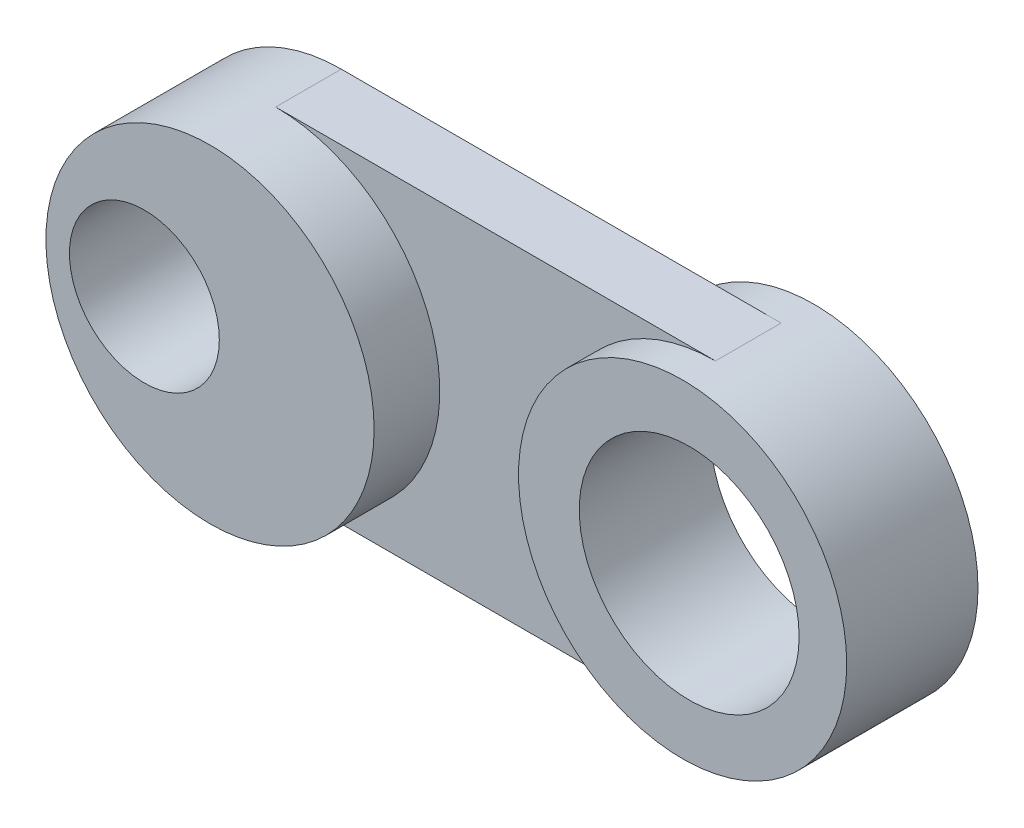
ISO-10303-21;
HEADER;
FILE_DESCRIPTION(('STEP AP214'),'2;1');
FILE_NAME('part.step','',(''),(''),'','','');
FILE_SCHEMA(('AUTOMOTIVE_DESIGN { 1 0 10303 214 1 1 1 1 }'));
ENDSEC;
DATA;
#1=APPLICATION_CONTEXT('core data for automotive mechanical design processes');
#2=APPLICATION_PROTOCOL_DEFINITION('international standard','automotive_design',2000,#1);
#3=PRODUCT_CONTEXT('',#1,'mechanical');
#4=PRODUCT('Part','Part','',(#3));
#5=PRODUCT_RELATED_PRODUCT_CATEGORY('part','',(#4));
#6=PRODUCT_DEFINITION_FORMATION('','',#4);
#7=PRODUCT_DEFINITION_CONTEXT('part definition',#1,'design');
#8=PRODUCT_DEFINITION('design','',#6,#7);
#9=PRODUCT_DEFINITION_SHAPE('','',#8);
#10=(LENGTH_UNIT() NAMED_UNIT(*) SI_UNIT(.MILLI.,.METRE.));
#11=(NAMED_UNIT(*) PLANE_ANGLE_UNIT() SI_UNIT($,.RADIAN.));
#12=(NAMED_UNIT(*) SI_UNIT($,.STERADIAN.) SOLID_ANGLE_UNIT());
#13=UNCERTAINTY_MEASURE_WITH_UNIT(LENGTH_MEASURE(1.E-05),#10,'distance_accuracy_value','');
#14=(GEOMETRIC_REPRESENTATION_CONTEXT(3) GLOBAL_UNCERTAINTY_ASSIGNED_CONTEXT((#13)) GLOBAL_UNIT_ASSIGNED_CONTEXT((#10,
#11,#12)) REPRESENTATION_CONTEXT('',''));
#15=CARTESIAN_POINT('',(0.,0.,0.));
#16=DIRECTION('',(0.,0.,1.));
#17=DIRECTION('',(1.,0.,0.));
#18=AXIS2_PLACEMENT_3D('',#15,#16,#17);
#19=CARTESIAN_POINT('',(0.,6.35,1.27));
#20=DIRECTION('',(0.,0.,-1.));
#21=DIRECTION('',(-1.,0.,0.));
#22=AXIS2_PLACEMENT_3D('',#19,#20,#21);
#23=PLANE('',#22);
#24=CARTESIAN_POINT('',(17.018,6.35,1.27));
#25=DIRECTION('',(0.,0.,-1.));
#26=DIRECTION('',(-1.,0.,0.));
#27=AXIS2_PLACEMENT_3D('',#24,#25,#26);
#28=CIRCLE('',#27,6.35);
#29=CARTESIAN_POINT('',(17.018,12.7,1.27));
#30=VERTEX_POINT('',#29);
#31=CARTESIAN_POINT('',(17.018,0.,1.27));
#32=VERTEX_POINT('',#31);
#33=EDGE_CURVE('E64',#30,#32,#28,.F.);
#34=ORIENTED_EDGE('',*,*,#33,.F.);
#35=DIRECTION('',(-1.,0.,0.));
#36=VECTOR('',#35,1.);
#37=CARTESIAN_POINT('',(0.,12.7,1.27));
#38=LINE('',#37,#36);
#39=CARTESIAN_POINT('',(0.,12.7,1.27));
#40=VERTEX_POINT('',#39);
#41=EDGE_CURVE('E102',#30,#40,#38,.T.);
#42=ORIENTED_EDGE('',*,*,#41,.T.);
#43=CARTESIAN_POINT('',(0.,6.35,1.27));
#44=DIRECTION('',(0.,0.,1.));
#45=DIRECTION('',(1.,0.,0.));
#46=AXIS2_PLACEMENT_3D('',#43,#44,#45);
#47=CIRCLE('',#46,6.35);
#48=CARTESIAN_POINT('',(0.,0.,1.27));
#49=VERTEX_POINT('',#48);
#50=EDGE_CURVE('E11',#49,#40,#47,.T.);
#51=ORIENTED_EDGE('',*,*,#50,.F.);
#52=DIRECTION('',(1.,0.,0.));
#53=VECTOR('',#52,1.);
#54=CARTESIAN_POINT('',(0.,0.,1.27));
#55=LINE('',#54,#53);
#56=EDGE_CURVE('E93',#49,#32,#55,.T.);
#57=ORIENTED_EDGE('',*,*,#56,.T.);
#58=EDGE_LOOP('',(#34,#42,#51,#57));
#59=FACE_BOUND('',#58,.T.);
#60=ADVANCED_FACE('F45',(#59),#23,.F.);
#61=CARTESIAN_POINT('',(0.,6.35,-1.27));
#62=DIRECTION('',(0.,0.,-1.));
#63=DIRECTION('',(-1.,0.,0.));
#64=AXIS2_PLACEMENT_3D('',#61,#62,#63);
#65=PLANE('',#64);
#66=CARTESIAN_POINT('',(-2.54,6.35,-1.27));
#67=DIRECTION('',(0.,0.,1.));
#68=DIRECTION('',(1.,0.,0.));
#69=AXIS2_PLACEMENT_3D('',#66,#67,#68);
#70=CIRCLE('',#69,2.9);
#71=CARTESIAN_POINT('',(0.36,6.35,-1.27));
#72=VERTEX_POINT('',#71);
#73=EDGE_CURVE('E107',#72,#72,#70,.T.);
#74=ORIENTED_EDGE('',*,*,#73,.T.);
#75=EDGE_LOOP('',(#74));
#76=FACE_BOUND('',#75,.T.);
#77=DIRECTION('',(-1.,0.,0.));
#78=VECTOR('',#77,1.);
#79=CARTESIAN_POINT('',(0.,12.7,-1.27));
#80=LINE('',#79,#78);
#81=CARTESIAN_POINT('',(17.018,12.7,-1.27));
#82=VERTEX_POINT('',#81);
#83=CARTESIAN_POINT('',(0.,12.7,-1.27));
#84=VERTEX_POINT('',#83);
#85=EDGE_CURVE('E84',#82,#84,#80,.T.);
#86=ORIENTED_EDGE('',*,*,#85,.F.);
#87=CARTESIAN_POINT('',(17.018,6.35,-1.27));
#88=DIRECTION('',(0.,0.,-1.));
#89=DIRECTION('',(-1.,0.,0.));
#90=AXIS2_PLACEMENT_3D('',#87,#88,#89);
#91=CIRCLE('',#90,6.35);
#92=CARTESIAN_POINT('',(17.018,0.,-1.27));
#93=VERTEX_POINT('',#92);
#94=EDGE_CURVE('E78',#82,#93,#91,.F.);
#95=ORIENTED_EDGE('',*,*,#94,.T.);
#96=DIRECTION('',(1.,0.,0.));
#97=VECTOR('',#96,1.);
#98=CARTESIAN_POINT('',(0.,0.,-1.27));
#99=LINE('',#98,#97);
#100=CARTESIAN_POINT('',(0.,0.,-1.27));
#101=VERTEX_POINT('',#100);
#102=EDGE_CURVE('E94',#101,#93,#99,.T.);
#103=ORIENTED_EDGE('',*,*,#102,.F.);
#104=CARTESIAN_POINT('',(0.,6.35,-1.27));
#105=DIRECTION('',(0.,0.,1.));
#106=DIRECTION('',(-1.,0.,0.));
#107=AXIS2_PLACEMENT_3D('',#104,#105,#106);
#108=CIRCLE('',#107,6.35);
#109=EDGE_CURVE('E100',#84,#101,#108,.T.);
#110=ORIENTED_EDGE('',*,*,#109,.F.);
#111=EDGE_LOOP('',(#86,#95,#103,#110));
#112=FACE_BOUND('',#111,.T.);
#113=ADVANCED_FACE('F104',(#76,#112),#65,.T.);
#114=CARTESIAN_POINT('',(0.,6.35,1.27));
#115=DIRECTION('',(0.,0.,-1.));
#116=DIRECTION('',(-1.,0.,0.));
#117=AXIS2_PLACEMENT_3D('',#114,#115,#116);
#118=CYLINDRICAL_SURFACE('',#117,6.35);
#119=ORIENTED_EDGE('',*,*,#109,.T.);
#120=DIRECTION('',(0.,0.,-1.));
#121=VECTOR('',#120,1.);
#122=CARTESIAN_POINT('',(0.,0.,1.27));
#123=LINE('',#122,#121);
#124=EDGE_CURVE('E49',#49,#101,#123,.T.);
#125=ORIENTED_EDGE('',*,*,#124,.F.);
#126=ORIENTED_EDGE('',*,*,#50,.T.);
#127=DIRECTION('',(0.,0.,-1.));
#128=VECTOR('',#127,1.);
#129=CARTESIAN_POINT('',(0.,12.7,1.27));
#130=LINE('',#129,#128);
#131=EDGE_CURVE('E88',#40,#84,#130,.T.);
#132=ORIENTED_EDGE('',*,*,#131,.T.);
#133=EDGE_LOOP('',(#119,#125,#126,#132));
#134=FACE_BOUND('',#133,.T.);
#135=CARTESIAN_POINT('',(0.,6.35,3.81));
#136=DIRECTION('',(0.,0.,1.));
#137=DIRECTION('',(1.,0.,0.));
#138=AXIS2_PLACEMENT_3D('',#135,#136,#137);
#139=CIRCLE('',#138,6.35);
#140=CARTESIAN_POINT('',(6.35,6.35,3.81));
#141=VERTEX_POINT('',#140);
#142=EDGE_CURVE('E113',#141,#141,#139,.T.);
#143=ORIENTED_EDGE('',*,*,#142,.F.);
#144=EDGE_LOOP('',(#143));
#145=FACE_BOUND('',#144,.T.);
#146=ADVANCED_FACE('F47',(#134,#145),#118,.T.);
#147=CARTESIAN_POINT('',(0.,0.,1.27));
#148=DIRECTION('',(0.,1.,0.));
#149=DIRECTION('',(-1.,0.,0.));
#150=AXIS2_PLACEMENT_3D('',#147,#148,#149);
#151=PLANE('',#150);
#152=ORIENTED_EDGE('',*,*,#102,.T.);
#153=DIRECTION('',(0.,0.,-1.));
#154=VECTOR('',#153,1.);
#155=CARTESIAN_POINT('',(17.018,0.,1.27));
#156=LINE('',#155,#154);
#157=EDGE_CURVE('E119',#32,#93,#156,.T.);
#158=ORIENTED_EDGE('',*,*,#157,.F.);
#159=ORIENTED_EDGE('',*,*,#56,.F.);
#160=ORIENTED_EDGE('',*,*,#124,.T.);
#161=EDGE_LOOP('',(#152,#158,#159,#160));
#162=FACE_BOUND('',#161,.T.);
#163=ADVANCED_FACE('F127',(#162),#151,.F.);
#164=CARTESIAN_POINT('',(17.018,6.35,1.27));
#165=DIRECTION('',(0.,0.,-1.));
#166=DIRECTION('',(-1.,0.,0.));
#167=AXIS2_PLACEMENT_3D('',#164,#165,#166);
#168=CYLINDRICAL_SURFACE('',#167,6.35);
#169=ORIENTED_EDGE('',*,*,#157,.T.);
#170=ORIENTED_EDGE('',*,*,#94,.F.);
#171=DIRECTION('',(0.,0.,-1.));
#172=VECTOR('',#171,1.);
#173=CARTESIAN_POINT('',(17.018,12.7,1.27));
#174=LINE('',#173,#172);
#175=EDGE_CURVE('E90',#30,#82,#174,.T.);
#176=ORIENTED_EDGE('',*,*,#175,.F.);
#177=ORIENTED_EDGE('',*,*,#33,.T.);
#178=EDGE_LOOP('',(#169,#170,#176,#177));
#179=FACE_BOUND('',#178,.T.);
#180=CARTESIAN_POINT('',(17.018,6.35,-2.54));
#181=DIRECTION('',(0.,0.,1.));
#182=DIRECTION('',(1.,0.,0.));
#183=AXIS2_PLACEMENT_3D('',#180,#181,#182);
#184=CIRCLE('',#183,6.35);
#185=CARTESIAN_POINT('',(23.368,6.35,-2.54));
#186=VERTEX_POINT('',#185);
#187=EDGE_CURVE('E144',#186,#186,#184,.T.);
#188=ORIENTED_EDGE('',*,*,#187,.T.);
#189=EDGE_LOOP('',(#188));
#190=FACE_BOUND('',#189,.T.);
#191=CARTESIAN_POINT('',(17.018,6.35,2.54));
#192=DIRECTION('',(0.,0.,1.));
#193=DIRECTION('',(1.,0.,0.));
#194=AXIS2_PLACEMENT_3D('',#191,#192,#193);
#195=CIRCLE('',#194,6.35);
#196=CARTESIAN_POINT('',(23.368,6.35,2.54));
#197=VERTEX_POINT('',#196);
#198=EDGE_CURVE('E143',#197,#197,#195,.T.);
#199=ORIENTED_EDGE('',*,*,#198,.F.);
#200=EDGE_LOOP('',(#199));
#201=FACE_BOUND('',#200,.T.);
#202=ADVANCED_FACE('F185',(#179,#190,#201),#168,.T.);
#203=CARTESIAN_POINT('',(0.,12.7,1.27));
#204=DIRECTION('',(0.,-1.,0.));
#205=DIRECTION('',(1.,0.,0.));
#206=AXIS2_PLACEMENT_3D('',#203,#204,#205);
#207=PLANE('',#206);
#208=ORIENTED_EDGE('',*,*,#85,.T.);
#209=ORIENTED_EDGE('',*,*,#131,.F.);
#210=ORIENTED_EDGE('',*,*,#41,.F.);
#211=ORIENTED_EDGE('',*,*,#175,.T.);
#212=EDGE_LOOP('',(#208,#209,#210,#211));
#213=FACE_BOUND('',#212,.T.);
#214=ADVANCED_FACE('F86',(#213),#207,.F.);
#215=CARTESIAN_POINT('',(-2.54,6.35,1.27));
#216=DIRECTION('',(0.,0.,-1.));
#217=DIRECTION('',(-1.,0.,0.));
#218=AXIS2_PLACEMENT_3D('',#215,#216,#217);
#219=CYLINDRICAL_SURFACE('',#218,2.9);
#220=ORIENTED_EDGE('',*,*,#73,.F.);
#221=EDGE_LOOP('',(#220));
#222=FACE_BOUND('',#221,.T.);
#223=CARTESIAN_POINT('',(-2.54,6.35,3.81));
#224=DIRECTION('',(0.,0.,1.));
#225=DIRECTION('',(1.,0.,0.));
#226=AXIS2_PLACEMENT_3D('',#223,#224,#225);
#227=CIRCLE('',#226,2.9);
#228=CARTESIAN_POINT('',(0.36,6.35,3.81));
#229=VERTEX_POINT('',#228);
#230=EDGE_CURVE('E135',#229,#229,#227,.F.);
#231=ORIENTED_EDGE('',*,*,#230,.F.);
#232=EDGE_LOOP('',(#231));
#233=FACE_BOUND('',#232,.T.);
#234=ADVANCED_FACE('F184',(#222,#233),#219,.F.);
#235=CARTESIAN_POINT('',(0.,0.,3.81));
#236=DIRECTION('',(0.,0.,1.));
#237=DIRECTION('',(1.,0.,0.));
#238=AXIS2_PLACEMENT_3D('',#235,#236,#237);
#239=PLANE('',#238);
#240=ORIENTED_EDGE('',*,*,#230,.T.);
#241=EDGE_LOOP('',(#240));
#242=FACE_BOUND('',#241,.T.);
#243=ORIENTED_EDGE('',*,*,#142,.T.);
#244=EDGE_LOOP('',(#243));
#245=FACE_BOUND('',#244,.T.);
#246=ADVANCED_FACE('F232',(#242,#245),#239,.T.);
#247=CARTESIAN_POINT('',(17.018,6.35,-2.54));
#248=DIRECTION('',(0.,0.,1.));
#249=DIRECTION('',(1.,0.,0.));
#250=AXIS2_PLACEMENT_3D('',#247,#248,#249);
#251=PLANE('',#250);
#252=ORIENTED_EDGE('',*,*,#187,.F.);
#253=EDGE_LOOP('',(#252));
#254=FACE_BOUND('',#253,.T.);
#255=CARTESIAN_POINT('',(17.272,6.35,-2.54));
#256=DIRECTION('',(0.,0.,1.));
#257=DIRECTION('',(1.,0.,0.));
#258=AXIS2_PLACEMENT_3D('',#255,#256,#257);
#259=CIRCLE('',#258,4.2545);
#260=CARTESIAN_POINT('',(21.5265,6.35,-2.54));
#261=VERTEX_POINT('',#260);
#262=EDGE_CURVE('E152',#261,#261,#259,.T.);
#263=ORIENTED_EDGE('',*,*,#262,.T.);
#264=EDGE_LOOP('',(#263));
#265=FACE_BOUND('',#264,.T.);
#266=ADVANCED_FACE('F169',(#254,#265),#251,.F.);
#267=CARTESIAN_POINT('',(17.272,6.35,1.27));
#268=DIRECTION('',(0.,0.,-1.));
#269=DIRECTION('',(-1.,0.,0.));
#270=AXIS2_PLACEMENT_3D('',#267,#268,#269);
#271=CYLINDRICAL_SURFACE('',#270,4.2545);
#272=ORIENTED_EDGE('',*,*,#262,.F.);
#273=EDGE_LOOP('',(#272));
#274=FACE_BOUND('',#273,.T.);
#275=CARTESIAN_POINT('',(17.272,6.35,2.54));
#276=DIRECTION('',(0.,0.,1.));
#277=DIRECTION('',(1.,0.,0.));
#278=AXIS2_PLACEMENT_3D('',#275,#276,#277);
#279=CIRCLE('',#278,4.2545);
#280=CARTESIAN_POINT('',(21.5265,6.35,2.54));
#281=VERTEX_POINT('',#280);
#282=EDGE_CURVE('E148',#281,#281,#279,.T.);
#283=ORIENTED_EDGE('',*,*,#282,.T.);
#284=EDGE_LOOP('',(#283));
#285=FACE_BOUND('',#284,.T.);
#286=ADVANCED_FACE('F160',(#274,#285),#271,.F.);
#287=CARTESIAN_POINT('',(17.018,6.35,2.54));
#288=DIRECTION('',(0.,0.,1.));
#289=DIRECTION('',(1.,0.,0.));
#290=AXIS2_PLACEMENT_3D('',#287,#288,#289);
#291=PLANE('',#290);
#292=ORIENTED_EDGE('',*,*,#198,.T.);
#293=EDGE_LOOP('',(#292));
#294=FACE_BOUND('',#293,.T.);
#295=ORIENTED_EDGE('',*,*,#282,.F.);
#296=EDGE_LOOP('',(#295));
#297=FACE_BOUND('',#296,.T.);
#298=ADVANCED_FACE('F162',(#294,#297),#291,.T.);
#299=CLOSED_SHELL('',(#60,#113,#146,#163,#202,#214,#234,#246,#266,#286,#298));
#300=MANIFOLD_SOLID_BREP('B2',#299);
#301=ADVANCED_BREP_SHAPE_REPRESENTATION('',(#18,#300),#14);
#302=SHAPE_DEFINITION_REPRESENTATION(#9,#301);
ENDSEC;
END-ISO-10303-21;
